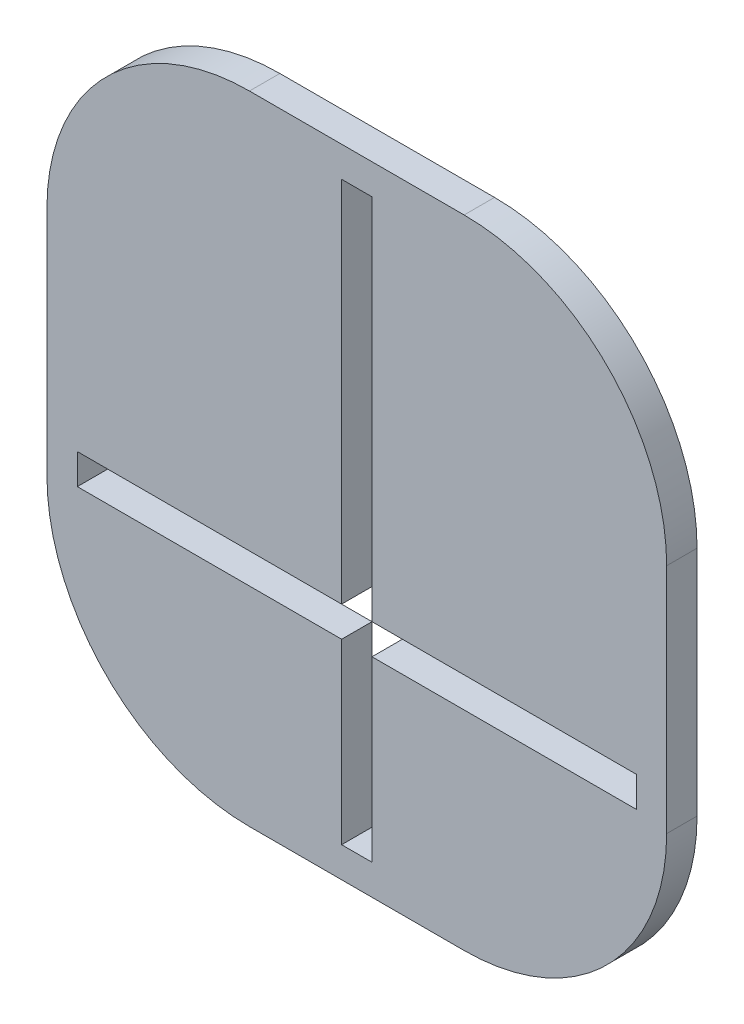
ISO-10303-21;
HEADER;
FILE_DESCRIPTION(('STEP AP214'),'2;1');
FILE_NAME('part.step','',(''),(''),'','','');
FILE_SCHEMA(('AUTOMOTIVE_DESIGN { 1 0 10303 214 1 1 1 1 }'));
ENDSEC;
DATA;
#1=APPLICATION_CONTEXT('core data for automotive mechanical design processes');
#2=APPLICATION_PROTOCOL_DEFINITION('international standard','automotive_design',2000,#1);
#3=PRODUCT_CONTEXT('',#1,'mechanical');
#4=PRODUCT('Part','Part','',(#3));
#5=PRODUCT_RELATED_PRODUCT_CATEGORY('part','',(#4));
#6=PRODUCT_DEFINITION_FORMATION('','',#4);
#7=PRODUCT_DEFINITION_CONTEXT('part definition',#1,'design');
#8=PRODUCT_DEFINITION('design','',#6,#7);
#9=PRODUCT_DEFINITION_SHAPE('','',#8);
#10=(LENGTH_UNIT() NAMED_UNIT(*) SI_UNIT(.MILLI.,.METRE.));
#11=(NAMED_UNIT(*) PLANE_ANGLE_UNIT() SI_UNIT($,.RADIAN.));
#12=(NAMED_UNIT(*) SI_UNIT($,.STERADIAN.) SOLID_ANGLE_UNIT());
#13=UNCERTAINTY_MEASURE_WITH_UNIT(LENGTH_MEASURE(1.E-05),#10,'distance_accuracy_value','');
#14=(GEOMETRIC_REPRESENTATION_CONTEXT(3) GLOBAL_UNCERTAINTY_ASSIGNED_CONTEXT((#13)) GLOBAL_UNIT_ASSIGNED_CONTEXT((#10,
#11,#12)) REPRESENTATION_CONTEXT('',''));
#15=CARTESIAN_POINT('',(0.,0.,0.));
#16=DIRECTION('',(0.,0.,1.));
#17=DIRECTION('',(1.,0.,0.));
#18=AXIS2_PLACEMENT_3D('',#15,#16,#17);
#19=CARTESIAN_POINT('',(0.,31.455,3.));
#20=DIRECTION('',(0.,-1.,0.));
#21=DIRECTION('',(1.,0.,0.));
#22=AXIS2_PLACEMENT_3D('',#19,#20,#21);
#23=PLANE('',#22);
#24=DIRECTION('',(-1.,0.,0.));
#25=VECTOR('',#24,1.);
#26=CARTESIAN_POINT('',(0.,31.455,0.));
#27=LINE('',#26,#25);
#28=CARTESIAN_POINT('',(10.6,31.455,0.));
#29=VERTEX_POINT('',#28);
#30=CARTESIAN_POINT('',(-10.6,31.455,0.));
#31=VERTEX_POINT('',#30);
#32=EDGE_CURVE('E254',#29,#31,#27,.T.);
#33=ORIENTED_EDGE('',*,*,#32,.T.);
#34=DIRECTION('',(0.,0.,-1.));
#35=VECTOR('',#34,1.);
#36=CARTESIAN_POINT('',(-10.6,31.455,3.));
#37=LINE('',#36,#35);
#38=CARTESIAN_POINT('',(-10.6,31.455,3.));
#39=VERTEX_POINT('',#38);
#40=EDGE_CURVE('E11',#39,#31,#37,.T.);
#41=ORIENTED_EDGE('',*,*,#40,.F.);
#42=DIRECTION('',(-1.,0.,0.));
#43=VECTOR('',#42,1.);
#44=CARTESIAN_POINT('',(0.,31.455,3.));
#45=LINE('',#44,#43);
#46=CARTESIAN_POINT('',(10.6,31.455,3.));
#47=VERTEX_POINT('',#46);
#48=EDGE_CURVE('E405',#47,#39,#45,.T.);
#49=ORIENTED_EDGE('',*,*,#48,.F.);
#50=DIRECTION('',(0.,0.,-1.));
#51=VECTOR('',#50,1.);
#52=CARTESIAN_POINT('',(10.6,31.455,3.));
#53=LINE('',#52,#51);
#54=EDGE_CURVE('E281',#47,#29,#53,.T.);
#55=ORIENTED_EDGE('',*,*,#54,.T.);
#56=EDGE_LOOP('',(#33,#41,#49,#55));
#57=FACE_BOUND('',#56,.T.);
#58=ADVANCED_FACE('F45',(#57),#23,.F.);
#59=CARTESIAN_POINT('',(-10.6,11.455,3.));
#60=DIRECTION('',(0.,0.,-1.));
#61=DIRECTION('',(-1.,0.,0.));
#62=AXIS2_PLACEMENT_3D('',#59,#60,#61);
#63=CYLINDRICAL_SURFACE('',#62,20.);
#64=CARTESIAN_POINT('',(-10.6,11.455,0.));
#65=DIRECTION('',(0.,0.,1.));
#66=DIRECTION('',(1.,0.,0.));
#67=AXIS2_PLACEMENT_3D('',#64,#65,#66);
#68=CIRCLE('',#67,20.);
#69=CARTESIAN_POINT('',(-30.6,11.455,0.));
#70=VERTEX_POINT('',#69);
#71=EDGE_CURVE('E258',#31,#70,#68,.T.);
#72=ORIENTED_EDGE('',*,*,#71,.T.);
#73=DIRECTION('',(0.,0.,-1.));
#74=VECTOR('',#73,1.);
#75=CARTESIAN_POINT('',(-30.6,11.455,3.));
#76=LINE('',#75,#74);
#77=CARTESIAN_POINT('',(-30.6,11.455,3.));
#78=VERTEX_POINT('',#77);
#79=EDGE_CURVE('E56',#78,#70,#76,.T.);
#80=ORIENTED_EDGE('',*,*,#79,.F.);
#81=CARTESIAN_POINT('',(-10.6,11.455,3.));
#82=DIRECTION('',(0.,0.,1.));
#83=DIRECTION('',(1.,0.,0.));
#84=AXIS2_PLACEMENT_3D('',#81,#82,#83);
#85=CIRCLE('',#84,20.);
#86=EDGE_CURVE('E408',#39,#78,#85,.T.);
#87=ORIENTED_EDGE('',*,*,#86,.F.);
#88=ORIENTED_EDGE('',*,*,#40,.T.);
#89=EDGE_LOOP('',(#72,#80,#87,#88));
#90=FACE_BOUND('',#89,.T.);
#91=ADVANCED_FACE('F440',(#90),#63,.T.);
#92=CARTESIAN_POINT('',(-30.6,0.,3.));
#93=DIRECTION('',(-1.,0.,0.));
#94=DIRECTION('',(0.,-1.,0.));
#95=AXIS2_PLACEMENT_3D('',#92,#93,#94);
#96=PLANE('',#95);
#97=DIRECTION('',(0.,1.,0.));
#98=VECTOR('',#97,1.);
#99=CARTESIAN_POINT('',(-30.6,0.,0.));
#100=LINE('',#99,#98);
#101=CARTESIAN_POINT('',(-30.6,-11.455,0.));
#102=VERTEX_POINT('',#101);
#103=EDGE_CURVE('E262',#102,#70,#100,.T.);
#104=ORIENTED_EDGE('',*,*,#103,.F.);
#105=DIRECTION('',(0.,0.,-1.));
#106=VECTOR('',#105,1.);
#107=CARTESIAN_POINT('',(-30.6,-11.455,3.));
#108=LINE('',#107,#106);
#109=CARTESIAN_POINT('',(-30.6,-11.455,3.));
#110=VERTEX_POINT('',#109);
#111=EDGE_CURVE('E291',#110,#102,#108,.T.);
#112=ORIENTED_EDGE('',*,*,#111,.F.);
#113=DIRECTION('',(0.,1.,0.));
#114=VECTOR('',#113,1.);
#115=CARTESIAN_POINT('',(-30.6,0.,3.));
#116=LINE('',#115,#114);
#117=EDGE_CURVE('E411',#110,#78,#116,.T.);
#118=ORIENTED_EDGE('',*,*,#117,.T.);
#119=ORIENTED_EDGE('',*,*,#79,.T.);
#120=EDGE_LOOP('',(#104,#112,#118,#119));
#121=FACE_BOUND('',#120,.T.);
#122=ADVANCED_FACE('F445',(#121),#96,.T.);
#123=CARTESIAN_POINT('',(-10.6,-11.455,3.));
#124=DIRECTION('',(0.,0.,-1.));
#125=DIRECTION('',(-1.,0.,0.));
#126=AXIS2_PLACEMENT_3D('',#123,#124,#125);
#127=CYLINDRICAL_SURFACE('',#126,20.);
#128=CARTESIAN_POINT('',(-10.6,-11.455,0.));
#129=DIRECTION('',(0.,0.,1.));
#130=DIRECTION('',(1.,0.,0.));
#131=AXIS2_PLACEMENT_3D('',#128,#129,#130);
#132=CIRCLE('',#131,20.);
#133=CARTESIAN_POINT('',(-10.6,-31.455,0.));
#134=VERTEX_POINT('',#133);
#135=EDGE_CURVE('E266',#134,#102,#132,.F.);
#136=ORIENTED_EDGE('',*,*,#135,.F.);
#137=DIRECTION('',(0.,0.,-1.));
#138=VECTOR('',#137,1.);
#139=CARTESIAN_POINT('',(-10.6,-31.455,3.));
#140=LINE('',#139,#138);
#141=CARTESIAN_POINT('',(-10.6,-31.455,3.));
#142=VERTEX_POINT('',#141);
#143=EDGE_CURVE('E288',#142,#134,#140,.T.);
#144=ORIENTED_EDGE('',*,*,#143,.F.);
#145=CARTESIAN_POINT('',(-10.6,-11.455,3.));
#146=DIRECTION('',(0.,0.,1.));
#147=DIRECTION('',(1.,0.,0.));
#148=AXIS2_PLACEMENT_3D('',#145,#146,#147);
#149=CIRCLE('',#148,20.);
#150=EDGE_CURVE('E415',#142,#110,#149,.F.);
#151=ORIENTED_EDGE('',*,*,#150,.T.);
#152=ORIENTED_EDGE('',*,*,#111,.T.);
#153=EDGE_LOOP('',(#136,#144,#151,#152));
#154=FACE_BOUND('',#153,.T.);
#155=ADVANCED_FACE('F608',(#154),#127,.T.);
#156=CARTESIAN_POINT('',(0.,-31.455,3.));
#157=DIRECTION('',(0.,-1.,0.));
#158=DIRECTION('',(1.,0.,0.));
#159=AXIS2_PLACEMENT_3D('',#156,#157,#158);
#160=PLANE('',#159);
#161=DIRECTION('',(-1.,0.,0.));
#162=VECTOR('',#161,1.);
#163=CARTESIAN_POINT('',(0.,-31.455,0.));
#164=LINE('',#163,#162);
#165=CARTESIAN_POINT('',(10.6,-31.455,0.));
#166=VERTEX_POINT('',#165);
#167=EDGE_CURVE('E270',#166,#134,#164,.T.);
#168=ORIENTED_EDGE('',*,*,#167,.F.);
#169=DIRECTION('',(0.,0.,-1.));
#170=VECTOR('',#169,1.);
#171=CARTESIAN_POINT('',(10.6,-31.455,3.));
#172=LINE('',#171,#170);
#173=CARTESIAN_POINT('',(10.6,-31.455,3.));
#174=VERTEX_POINT('',#173);
#175=EDGE_CURVE('E212',#174,#166,#172,.T.);
#176=ORIENTED_EDGE('',*,*,#175,.F.);
#177=DIRECTION('',(-1.,0.,0.));
#178=VECTOR('',#177,1.);
#179=CARTESIAN_POINT('',(0.,-31.455,3.));
#180=LINE('',#179,#178);
#181=EDGE_CURVE('E203',#174,#142,#180,.T.);
#182=ORIENTED_EDGE('',*,*,#181,.T.);
#183=ORIENTED_EDGE('',*,*,#143,.T.);
#184=EDGE_LOOP('',(#168,#176,#182,#183));
#185=FACE_BOUND('',#184,.T.);
#186=ADVANCED_FACE('F421',(#185),#160,.T.);
#187=CARTESIAN_POINT('',(10.6,-11.455,3.));
#188=DIRECTION('',(0.,0.,-1.));
#189=DIRECTION('',(-1.,0.,0.));
#190=AXIS2_PLACEMENT_3D('',#187,#188,#189);
#191=CYLINDRICAL_SURFACE('',#190,20.);
#192=CARTESIAN_POINT('',(10.6,-11.455,0.));
#193=DIRECTION('',(0.,0.,1.));
#194=DIRECTION('',(1.,0.,0.));
#195=AXIS2_PLACEMENT_3D('',#192,#193,#194);
#196=CIRCLE('',#195,20.);
#197=CARTESIAN_POINT('',(30.6,-11.455,0.));
#198=VERTEX_POINT('',#197);
#199=EDGE_CURVE('E210',#166,#198,#196,.T.);
#200=ORIENTED_EDGE('',*,*,#199,.T.);
#201=DIRECTION('',(0.,0.,-1.));
#202=VECTOR('',#201,1.);
#203=CARTESIAN_POINT('',(30.6,-11.455,3.));
#204=LINE('',#203,#202);
#205=CARTESIAN_POINT('',(30.6,-11.455,3.));
#206=VERTEX_POINT('',#205);
#207=EDGE_CURVE('E207',#206,#198,#204,.T.);
#208=ORIENTED_EDGE('',*,*,#207,.F.);
#209=CARTESIAN_POINT('',(10.6,-11.455,3.));
#210=DIRECTION('',(0.,0.,1.));
#211=DIRECTION('',(1.,0.,0.));
#212=AXIS2_PLACEMENT_3D('',#209,#210,#211);
#213=CIRCLE('',#212,20.);
#214=EDGE_CURVE('E196',#174,#206,#213,.T.);
#215=ORIENTED_EDGE('',*,*,#214,.F.);
#216=ORIENTED_EDGE('',*,*,#175,.T.);
#217=EDGE_LOOP('',(#200,#208,#215,#216));
#218=FACE_BOUND('',#217,.T.);
#219=ADVANCED_FACE('F208',(#218),#191,.T.);
#220=CARTESIAN_POINT('',(30.6,0.,3.));
#221=DIRECTION('',(-1.,0.,0.));
#222=DIRECTION('',(0.,-1.,0.));
#223=AXIS2_PLACEMENT_3D('',#220,#221,#222);
#224=PLANE('',#223);
#225=DIRECTION('',(0.,1.,0.));
#226=VECTOR('',#225,1.);
#227=CARTESIAN_POINT('',(30.6,0.,0.));
#228=LINE('',#227,#226);
#229=CARTESIAN_POINT('',(30.6,11.455,0.));
#230=VERTEX_POINT('',#229);
#231=EDGE_CURVE('E130',#198,#230,#228,.T.);
#232=ORIENTED_EDGE('',*,*,#231,.T.);
#233=DIRECTION('',(0.,0.,-1.));
#234=VECTOR('',#233,1.);
#235=CARTESIAN_POINT('',(30.6,11.455,3.));
#236=LINE('',#235,#234);
#237=CARTESIAN_POINT('',(30.6,11.455,3.));
#238=VERTEX_POINT('',#237);
#239=EDGE_CURVE('E213',#238,#230,#236,.T.);
#240=ORIENTED_EDGE('',*,*,#239,.F.);
#241=DIRECTION('',(0.,1.,0.));
#242=VECTOR('',#241,1.);
#243=CARTESIAN_POINT('',(30.6,0.,3.));
#244=LINE('',#243,#242);
#245=EDGE_CURVE('E200',#206,#238,#244,.T.);
#246=ORIENTED_EDGE('',*,*,#245,.F.);
#247=ORIENTED_EDGE('',*,*,#207,.T.);
#248=EDGE_LOOP('',(#232,#240,#246,#247));
#249=FACE_BOUND('',#248,.T.);
#250=ADVANCED_FACE('F215',(#249),#224,.F.);
#251=CARTESIAN_POINT('',(0.,28.455,3.));
#252=DIRECTION('',(0.,1.,0.));
#253=DIRECTION('',(0.,0.,1.));
#254=AXIS2_PLACEMENT_3D('',#251,#252,#253);
#255=PLANE('',#254);
#256=DIRECTION('',(1.,0.,0.));
#257=VECTOR('',#256,1.);
#258=CARTESIAN_POINT('',(0.,28.455,0.));
#259=LINE('',#258,#257);
#260=CARTESIAN_POINT('',(-1.50000000000001,28.455,0.));
#261=VERTEX_POINT('',#260);
#262=CARTESIAN_POINT('',(1.50000000000001,28.455,0.));
#263=VERTEX_POINT('',#262);
#264=EDGE_CURVE('E223',#261,#263,#259,.T.);
#265=ORIENTED_EDGE('',*,*,#264,.T.);
#266=DIRECTION('',(0.,0.,-1.));
#267=VECTOR('',#266,1.);
#268=CARTESIAN_POINT('',(1.50000000000001,28.455,3.));
#269=LINE('',#268,#267);
#270=CARTESIAN_POINT('',(1.50000000000001,28.455,3.));
#271=VERTEX_POINT('',#270);
#272=EDGE_CURVE('E49',#271,#263,#269,.T.);
#273=ORIENTED_EDGE('',*,*,#272,.F.);
#274=DIRECTION('',(1.,0.,0.));
#275=VECTOR('',#274,1.);
#276=CARTESIAN_POINT('',(0.,28.455,3.));
#277=LINE('',#276,#275);
#278=CARTESIAN_POINT('',(-1.50000000000001,28.455,3.));
#279=VERTEX_POINT('',#278);
#280=EDGE_CURVE('E280',#279,#271,#277,.T.);
#281=ORIENTED_EDGE('',*,*,#280,.F.);
#282=DIRECTION('',(0.,0.,-1.));
#283=VECTOR('',#282,1.);
#284=CARTESIAN_POINT('',(-1.50000000000001,28.455,3.));
#285=LINE('',#284,#283);
#286=EDGE_CURVE('E219',#279,#261,#285,.T.);
#287=ORIENTED_EDGE('',*,*,#286,.T.);
#288=EDGE_LOOP('',(#265,#273,#281,#287));
#289=FACE_BOUND('',#288,.T.);
#290=ADVANCED_FACE('F47',(#289),#255,.F.);
#291=CARTESIAN_POINT('',(1.50000000000001,0.,3.));
#292=DIRECTION('',(1.,0.,0.));
#293=DIRECTION('',(0.,0.,-1.));
#294=AXIS2_PLACEMENT_3D('',#291,#292,#293);
#295=PLANE('',#294);
#296=DIRECTION('',(0.,-1.,0.));
#297=VECTOR('',#296,1.);
#298=CARTESIAN_POINT('',(1.50000000000001,0.,0.));
#299=LINE('',#298,#297);
#300=CARTESIAN_POINT('',(1.50000000000001,-7.88000000000001,0.));
#301=VERTEX_POINT('',#300);
#302=EDGE_CURVE('E227',#263,#301,#299,.T.);
#303=ORIENTED_EDGE('',*,*,#302,.T.);
#304=DIRECTION('',(0.,0.,-1.));
#305=VECTOR('',#304,1.);
#306=CARTESIAN_POINT('',(1.50000000000001,-7.88000000000001,3.));
#307=LINE('',#306,#305);
#308=CARTESIAN_POINT('',(1.50000000000001,-7.88000000000001,3.));
#309=VERTEX_POINT('',#308);
#310=EDGE_CURVE('E329',#309,#301,#307,.T.);
#311=ORIENTED_EDGE('',*,*,#310,.F.);
#312=DIRECTION('',(0.,-1.,0.));
#313=VECTOR('',#312,1.);
#314=CARTESIAN_POINT('',(1.50000000000001,0.,3.));
#315=LINE('',#314,#313);
#316=EDGE_CURVE('E145',#271,#309,#315,.T.);
#317=ORIENTED_EDGE('',*,*,#316,.F.);
#318=ORIENTED_EDGE('',*,*,#272,.T.);
#319=EDGE_LOOP('',(#303,#311,#317,#318));
#320=FACE_BOUND('',#319,.T.);
#321=ADVANCED_FACE('F337',(#320),#295,.F.);
#322=CARTESIAN_POINT('',(0.,-7.88000000000001,3.));
#323=DIRECTION('',(0.,1.,0.));
#324=DIRECTION('',(0.,0.,1.));
#325=AXIS2_PLACEMENT_3D('',#322,#323,#324);
#326=PLANE('',#325);
#327=DIRECTION('',(1.,0.,0.));
#328=VECTOR('',#327,1.);
#329=CARTESIAN_POINT('',(0.,-7.88000000000001,0.));
#330=LINE('',#329,#328);
#331=CARTESIAN_POINT('',(27.6,-7.88000000000001,0.));
#332=VERTEX_POINT('',#331);
#333=EDGE_CURVE('E230',#301,#332,#330,.T.);
#334=ORIENTED_EDGE('',*,*,#333,.T.);
#335=DIRECTION('',(0.,0.,-1.));
#336=VECTOR('',#335,1.);
#337=CARTESIAN_POINT('',(27.6,-7.88000000000001,3.));
#338=LINE('',#337,#336);
#339=CARTESIAN_POINT('',(27.6,-7.88000000000001,3.));
#340=VERTEX_POINT('',#339);
#341=EDGE_CURVE('E326',#340,#332,#338,.T.);
#342=ORIENTED_EDGE('',*,*,#341,.F.);
#343=DIRECTION('',(1.,0.,0.));
#344=VECTOR('',#343,1.);
#345=CARTESIAN_POINT('',(0.,-7.88000000000001,3.));
#346=LINE('',#345,#344);
#347=EDGE_CURVE('E477',#309,#340,#346,.T.);
#348=ORIENTED_EDGE('',*,*,#347,.F.);
#349=ORIENTED_EDGE('',*,*,#310,.T.);
#350=EDGE_LOOP('',(#334,#342,#348,#349));
#351=FACE_BOUND('',#350,.T.);
#352=ADVANCED_FACE('F452',(#351),#326,.F.);
#353=CARTESIAN_POINT('',(27.6,0.,3.));
#354=DIRECTION('',(1.,0.,0.));
#355=DIRECTION('',(0.,1.,0.));
#356=AXIS2_PLACEMENT_3D('',#353,#354,#355);
#357=PLANE('',#356);
#358=DIRECTION('',(0.,-1.,0.));
#359=VECTOR('',#358,1.);
#360=CARTESIAN_POINT('',(27.6,0.,0.));
#361=LINE('',#360,#359);
#362=CARTESIAN_POINT('',(27.6,-10.88,0.));
#363=VERTEX_POINT('',#362);
#364=EDGE_CURVE('E234',#332,#363,#361,.T.);
#365=ORIENTED_EDGE('',*,*,#364,.T.);
#366=DIRECTION('',(0.,0.,-1.));
#367=VECTOR('',#366,1.);
#368=CARTESIAN_POINT('',(27.6,-10.88,3.));
#369=LINE('',#368,#367);
#370=CARTESIAN_POINT('',(27.6,-10.88,3.));
#371=VERTEX_POINT('',#370);
#372=EDGE_CURVE('E322',#371,#363,#369,.T.);
#373=ORIENTED_EDGE('',*,*,#372,.F.);
#374=DIRECTION('',(0.,-1.,0.));
#375=VECTOR('',#374,1.);
#376=CARTESIAN_POINT('',(27.6,0.,3.));
#377=LINE('',#376,#375);
#378=EDGE_CURVE('E475',#340,#371,#377,.T.);
#379=ORIENTED_EDGE('',*,*,#378,.F.);
#380=ORIENTED_EDGE('',*,*,#341,.T.);
#381=EDGE_LOOP('',(#365,#373,#379,#380));
#382=FACE_BOUND('',#381,.T.);
#383=ADVANCED_FACE('F461',(#382),#357,.F.);
#384=CARTESIAN_POINT('',(0.,-10.88,3.));
#385=DIRECTION('',(0.,-1.,0.));
#386=DIRECTION('',(0.,0.,-1.));
#387=AXIS2_PLACEMENT_3D('',#384,#385,#386);
#388=PLANE('',#387);
#389=DIRECTION('',(-1.,0.,0.));
#390=VECTOR('',#389,1.);
#391=CARTESIAN_POINT('',(0.,-10.88,0.));
#392=LINE('',#391,#390);
#393=CARTESIAN_POINT('',(1.50000000000001,-10.88,0.));
#394=VERTEX_POINT('',#393);
#395=EDGE_CURVE('E238',#363,#394,#392,.T.);
#396=ORIENTED_EDGE('',*,*,#395,.T.);
#397=DIRECTION('',(0.,0.,-1.));
#398=VECTOR('',#397,1.);
#399=CARTESIAN_POINT('',(1.50000000000001,-10.88,3.));
#400=LINE('',#399,#398);
#401=CARTESIAN_POINT('',(1.50000000000001,-10.88,3.));
#402=VERTEX_POINT('',#401);
#403=EDGE_CURVE('E318',#402,#394,#400,.T.);
#404=ORIENTED_EDGE('',*,*,#403,.F.);
#405=DIRECTION('',(-1.,0.,0.));
#406=VECTOR('',#405,1.);
#407=CARTESIAN_POINT('',(0.,-10.88,3.));
#408=LINE('',#407,#406);
#409=EDGE_CURVE('E397',#371,#402,#408,.T.);
#410=ORIENTED_EDGE('',*,*,#409,.F.);
#411=ORIENTED_EDGE('',*,*,#372,.T.);
#412=EDGE_LOOP('',(#396,#404,#410,#411));
#413=FACE_BOUND('',#412,.T.);
#414=ADVANCED_FACE('F457',(#413),#388,.F.);
#415=CARTESIAN_POINT('',(1.50000000000001,-28.455,0.));
#416=VERTEX_POINT('',#415);
#417=EDGE_CURVE('E231',#394,#416,#299,.T.);
#418=ORIENTED_EDGE('',*,*,#417,.T.);
#419=DIRECTION('',(0.,0.,-1.));
#420=VECTOR('',#419,1.);
#421=CARTESIAN_POINT('',(1.50000000000001,-28.455,3.));
#422=LINE('',#421,#420);
#423=CARTESIAN_POINT('',(1.50000000000001,-28.455,3.));
#424=VERTEX_POINT('',#423);
#425=EDGE_CURVE('E315',#424,#416,#422,.T.);
#426=ORIENTED_EDGE('',*,*,#425,.F.);
#427=EDGE_CURVE('E391',#402,#424,#315,.T.);
#428=ORIENTED_EDGE('',*,*,#427,.F.);
#429=ORIENTED_EDGE('',*,*,#403,.T.);
#430=EDGE_LOOP('',(#418,#426,#428,#429));
#431=FACE_BOUND('',#430,.T.);
#432=ADVANCED_FACE('F377',(#431),#295,.F.);
#433=CARTESIAN_POINT('',(0.,-28.455,3.));
#434=DIRECTION('',(0.,1.,0.));
#435=DIRECTION('',(0.,0.,1.));
#436=AXIS2_PLACEMENT_3D('',#433,#434,#435);
#437=PLANE('',#436);
#438=DIRECTION('',(1.,0.,0.));
#439=VECTOR('',#438,1.);
#440=CARTESIAN_POINT('',(0.,-28.455,0.));
#441=LINE('',#440,#439);
#442=CARTESIAN_POINT('',(-1.50000000000001,-28.455,0.));
#443=VERTEX_POINT('',#442);
#444=EDGE_CURVE('E242',#443,#416,#441,.T.);
#445=ORIENTED_EDGE('',*,*,#444,.F.);
#446=DIRECTION('',(0.,0.,-1.));
#447=VECTOR('',#446,1.);
#448=CARTESIAN_POINT('',(-1.50000000000001,-28.455,3.));
#449=LINE('',#448,#447);
#450=CARTESIAN_POINT('',(-1.50000000000001,-28.455,3.));
#451=VERTEX_POINT('',#450);
#452=EDGE_CURVE('E312',#451,#443,#449,.T.);
#453=ORIENTED_EDGE('',*,*,#452,.F.);
#454=DIRECTION('',(1.,0.,0.));
#455=VECTOR('',#454,1.);
#456=CARTESIAN_POINT('',(0.,-28.455,3.));
#457=LINE('',#456,#455);
#458=EDGE_CURVE('E386',#451,#424,#457,.T.);
#459=ORIENTED_EDGE('',*,*,#458,.T.);
#460=ORIENTED_EDGE('',*,*,#425,.T.);
#461=EDGE_LOOP('',(#445,#453,#459,#460));
#462=FACE_BOUND('',#461,.T.);
#463=ADVANCED_FACE('F384',(#462),#437,.T.);
#464=CARTESIAN_POINT('',(-1.50000000000001,0.,3.));
#465=DIRECTION('',(1.,0.,0.));
#466=DIRECTION('',(0.,0.,-1.));
#467=AXIS2_PLACEMENT_3D('',#464,#465,#466);
#468=PLANE('',#467);
#469=DIRECTION('',(0.,-1.,0.));
#470=VECTOR('',#469,1.);
#471=CARTESIAN_POINT('',(-1.50000000000001,0.,0.));
#472=LINE('',#471,#470);
#473=CARTESIAN_POINT('',(-1.50000000000001,-10.88,0.));
#474=VERTEX_POINT('',#473);
#475=EDGE_CURVE('E246',#474,#443,#472,.T.);
#476=ORIENTED_EDGE('',*,*,#475,.F.);
#477=DIRECTION('',(0.,0.,-1.));
#478=VECTOR('',#477,1.);
#479=CARTESIAN_POINT('',(-1.50000000000001,-10.88,3.));
#480=LINE('',#479,#478);
#481=CARTESIAN_POINT('',(-1.50000000000001,-10.88,3.));
#482=VERTEX_POINT('',#481);
#483=EDGE_CURVE('E309',#482,#474,#480,.T.);
#484=ORIENTED_EDGE('',*,*,#483,.F.);
#485=DIRECTION('',(0.,-1.,0.));
#486=VECTOR('',#485,1.);
#487=CARTESIAN_POINT('',(-1.50000000000001,0.,3.));
#488=LINE('',#487,#486);
#489=EDGE_CURVE('E390',#482,#451,#488,.T.);
#490=ORIENTED_EDGE('',*,*,#489,.T.);
#491=ORIENTED_EDGE('',*,*,#452,.T.);
#492=EDGE_LOOP('',(#476,#484,#490,#491));
#493=FACE_BOUND('',#492,.T.);
#494=ADVANCED_FACE('F436',(#493),#468,.T.);
#495=CARTESIAN_POINT('',(-27.6,-10.88,0.));
#496=VERTEX_POINT('',#495);
#497=EDGE_CURVE('E241',#474,#496,#392,.T.);
#498=ORIENTED_EDGE('',*,*,#497,.T.);
#499=DIRECTION('',(0.,0.,-1.));
#500=VECTOR('',#499,1.);
#501=CARTESIAN_POINT('',(-27.6,-10.88,3.));
#502=LINE('',#501,#500);
#503=CARTESIAN_POINT('',(-27.6,-10.88,3.));
#504=VERTEX_POINT('',#503);
#505=EDGE_CURVE('E305',#504,#496,#502,.T.);
#506=ORIENTED_EDGE('',*,*,#505,.F.);
#507=EDGE_CURVE('E369',#482,#504,#408,.T.);
#508=ORIENTED_EDGE('',*,*,#507,.F.);
#509=ORIENTED_EDGE('',*,*,#483,.T.);
#510=EDGE_LOOP('',(#498,#506,#508,#509));
#511=FACE_BOUND('',#510,.T.);
#512=ADVANCED_FACE('F368',(#511),#388,.F.);
#513=CARTESIAN_POINT('',(-27.6,0.,3.));
#514=DIRECTION('',(-1.,0.,0.));
#515=DIRECTION('',(0.,-1.,0.));
#516=AXIS2_PLACEMENT_3D('',#513,#514,#515);
#517=PLANE('',#516);
#518=DIRECTION('',(0.,1.,0.));
#519=VECTOR('',#518,1.);
#520=CARTESIAN_POINT('',(-27.6,0.,0.));
#521=LINE('',#520,#519);
#522=CARTESIAN_POINT('',(-27.6,-7.88000000000001,0.));
#523=VERTEX_POINT('',#522);
#524=EDGE_CURVE('E251',#496,#523,#521,.T.);
#525=ORIENTED_EDGE('',*,*,#524,.T.);
#526=DIRECTION('',(0.,0.,-1.));
#527=VECTOR('',#526,1.);
#528=CARTESIAN_POINT('',(-27.6,-7.88000000000001,3.));
#529=LINE('',#528,#527);
#530=CARTESIAN_POINT('',(-27.6,-7.88000000000001,3.));
#531=VERTEX_POINT('',#530);
#532=EDGE_CURVE('E301',#531,#523,#529,.T.);
#533=ORIENTED_EDGE('',*,*,#532,.F.);
#534=DIRECTION('',(0.,1.,0.));
#535=VECTOR('',#534,1.);
#536=CARTESIAN_POINT('',(-27.6,0.,3.));
#537=LINE('',#536,#535);
#538=EDGE_CURVE('E365',#504,#531,#537,.T.);
#539=ORIENTED_EDGE('',*,*,#538,.F.);
#540=ORIENTED_EDGE('',*,*,#505,.T.);
#541=EDGE_LOOP('',(#525,#533,#539,#540));
#542=FACE_BOUND('',#541,.T.);
#543=ADVANCED_FACE('F362',(#542),#517,.F.);
#544=CARTESIAN_POINT('',(-1.50000000000001,-7.88000000000001,0.));
#545=VERTEX_POINT('',#544);
#546=EDGE_CURVE('E235',#523,#545,#330,.T.);
#547=ORIENTED_EDGE('',*,*,#546,.T.);
#548=DIRECTION('',(0.,0.,-1.));
#549=VECTOR('',#548,1.);
#550=CARTESIAN_POINT('',(-1.50000000000001,-7.88000000000001,3.));
#551=LINE('',#550,#549);
#552=CARTESIAN_POINT('',(-1.50000000000001,-7.88000000000001,3.));
#553=VERTEX_POINT('',#552);
#554=EDGE_CURVE('E298',#553,#545,#551,.T.);
#555=ORIENTED_EDGE('',*,*,#554,.F.);
#556=EDGE_CURVE('E404',#531,#553,#346,.T.);
#557=ORIENTED_EDGE('',*,*,#556,.F.);
#558=ORIENTED_EDGE('',*,*,#532,.T.);
#559=EDGE_LOOP('',(#547,#555,#557,#558));
#560=FACE_BOUND('',#559,.T.);
#561=ADVANCED_FACE('F355',(#560),#326,.F.);
#562=EDGE_CURVE('E250',#261,#545,#472,.T.);
#563=ORIENTED_EDGE('',*,*,#562,.F.);
#564=ORIENTED_EDGE('',*,*,#286,.F.);
#565=EDGE_CURVE('E396',#279,#553,#488,.T.);
#566=ORIENTED_EDGE('',*,*,#565,.T.);
#567=ORIENTED_EDGE('',*,*,#554,.T.);
#568=EDGE_LOOP('',(#563,#564,#566,#567));
#569=FACE_BOUND('',#568,.T.);
#570=ADVANCED_FACE('F348',(#569),#468,.T.);
#571=CARTESIAN_POINT('',(10.6,11.455,3.));
#572=DIRECTION('',(0.,0.,-1.));
#573=DIRECTION('',(-1.,0.,0.));
#574=AXIS2_PLACEMENT_3D('',#571,#572,#573);
#575=CYLINDRICAL_SURFACE('',#574,20.);
#576=CARTESIAN_POINT('',(10.6,11.455,0.));
#577=DIRECTION('',(0.,0.,1.));
#578=DIRECTION('',(1.,0.,0.));
#579=AXIS2_PLACEMENT_3D('',#576,#577,#578);
#580=CIRCLE('',#579,20.);
#581=EDGE_CURVE('E136',#230,#29,#580,.T.);
#582=ORIENTED_EDGE('',*,*,#581,.T.);
#583=ORIENTED_EDGE('',*,*,#54,.F.);
#584=CARTESIAN_POINT('',(10.6,11.455,3.));
#585=DIRECTION('',(0.,0.,1.));
#586=DIRECTION('',(1.,0.,0.));
#587=AXIS2_PLACEMENT_3D('',#584,#585,#586);
#588=CIRCLE('',#587,20.);
#589=EDGE_CURVE('E65',#238,#47,#588,.T.);
#590=ORIENTED_EDGE('',*,*,#589,.F.);
#591=ORIENTED_EDGE('',*,*,#239,.T.);
#592=EDGE_LOOP('',(#582,#583,#590,#591));
#593=FACE_BOUND('',#592,.T.);
#594=ADVANCED_FACE('F427',(#593),#575,.T.);
#595=CARTESIAN_POINT('',(0.,0.,3.));
#596=DIRECTION('',(0.,0.,1.));
#597=DIRECTION('',(1.,0.,0.));
#598=AXIS2_PLACEMENT_3D('',#595,#596,#597);
#599=PLANE('',#598);
#600=ORIENTED_EDGE('',*,*,#280,.T.);
#601=ORIENTED_EDGE('',*,*,#316,.T.);
#602=ORIENTED_EDGE('',*,*,#347,.T.);
#603=ORIENTED_EDGE('',*,*,#378,.T.);
#604=ORIENTED_EDGE('',*,*,#409,.T.);
#605=ORIENTED_EDGE('',*,*,#427,.T.);
#606=ORIENTED_EDGE('',*,*,#458,.F.);
#607=ORIENTED_EDGE('',*,*,#489,.F.);
#608=ORIENTED_EDGE('',*,*,#507,.T.);
#609=ORIENTED_EDGE('',*,*,#538,.T.);
#610=ORIENTED_EDGE('',*,*,#556,.T.);
#611=ORIENTED_EDGE('',*,*,#565,.F.);
#612=EDGE_LOOP('',(#600,#601,#602,#603,#604,#605,#606,#607,#608,#609,#610,#611));
#613=FACE_BOUND('',#612,.T.);
#614=ORIENTED_EDGE('',*,*,#48,.T.);
#615=ORIENTED_EDGE('',*,*,#86,.T.);
#616=ORIENTED_EDGE('',*,*,#117,.F.);
#617=ORIENTED_EDGE('',*,*,#150,.F.);
#618=ORIENTED_EDGE('',*,*,#181,.F.);
#619=ORIENTED_EDGE('',*,*,#214,.T.);
#620=ORIENTED_EDGE('',*,*,#245,.T.);
#621=ORIENTED_EDGE('',*,*,#589,.T.);
#622=EDGE_LOOP('',(#614,#615,#616,#617,#618,#619,#620,#621));
#623=FACE_BOUND('',#622,.T.);
#624=ADVANCED_FACE('F198',(#613,#623),#599,.T.);
#625=CARTESIAN_POINT('',(0.,0.,0.));
#626=DIRECTION('',(0.,0.,1.));
#627=DIRECTION('',(1.,0.,0.));
#628=AXIS2_PLACEMENT_3D('',#625,#626,#627);
#629=PLANE('',#628);
#630=ORIENTED_EDGE('',*,*,#264,.F.);
#631=ORIENTED_EDGE('',*,*,#562,.T.);
#632=ORIENTED_EDGE('',*,*,#546,.F.);
#633=ORIENTED_EDGE('',*,*,#524,.F.);
#634=ORIENTED_EDGE('',*,*,#497,.F.);
#635=ORIENTED_EDGE('',*,*,#475,.T.);
#636=ORIENTED_EDGE('',*,*,#444,.T.);
#637=ORIENTED_EDGE('',*,*,#417,.F.);
#638=ORIENTED_EDGE('',*,*,#395,.F.);
#639=ORIENTED_EDGE('',*,*,#364,.F.);
#640=ORIENTED_EDGE('',*,*,#333,.F.);
#641=ORIENTED_EDGE('',*,*,#302,.F.);
#642=EDGE_LOOP('',(#630,#631,#632,#633,#634,#635,#636,#637,#638,#639,#640,#641));
#643=FACE_BOUND('',#642,.T.);
#644=ORIENTED_EDGE('',*,*,#32,.F.);
#645=ORIENTED_EDGE('',*,*,#581,.F.);
#646=ORIENTED_EDGE('',*,*,#231,.F.);
#647=ORIENTED_EDGE('',*,*,#199,.F.);
#648=ORIENTED_EDGE('',*,*,#167,.T.);
#649=ORIENTED_EDGE('',*,*,#135,.T.);
#650=ORIENTED_EDGE('',*,*,#103,.T.);
#651=ORIENTED_EDGE('',*,*,#71,.F.);
#652=EDGE_LOOP('',(#644,#645,#646,#647,#648,#649,#650,#651));
#653=FACE_BOUND('',#652,.T.);
#654=ADVANCED_FACE('F344',(#643,#653),#629,.F.);
#655=CLOSED_SHELL('',(#58,#91,#122,#155,#186,#219,#250,#290,#321,#352,#383,#414,#432,#463,#494,
#512,#543,#561,#570,#594,#624,#654));
#656=MANIFOLD_SOLID_BREP('B2',#655);
#657=ADVANCED_BREP_SHAPE_REPRESENTATION('',(#18,#656),#14);
#658=SHAPE_DEFINITION_REPRESENTATION(#9,#657);
ENDSEC;
END-ISO-10303-21;
